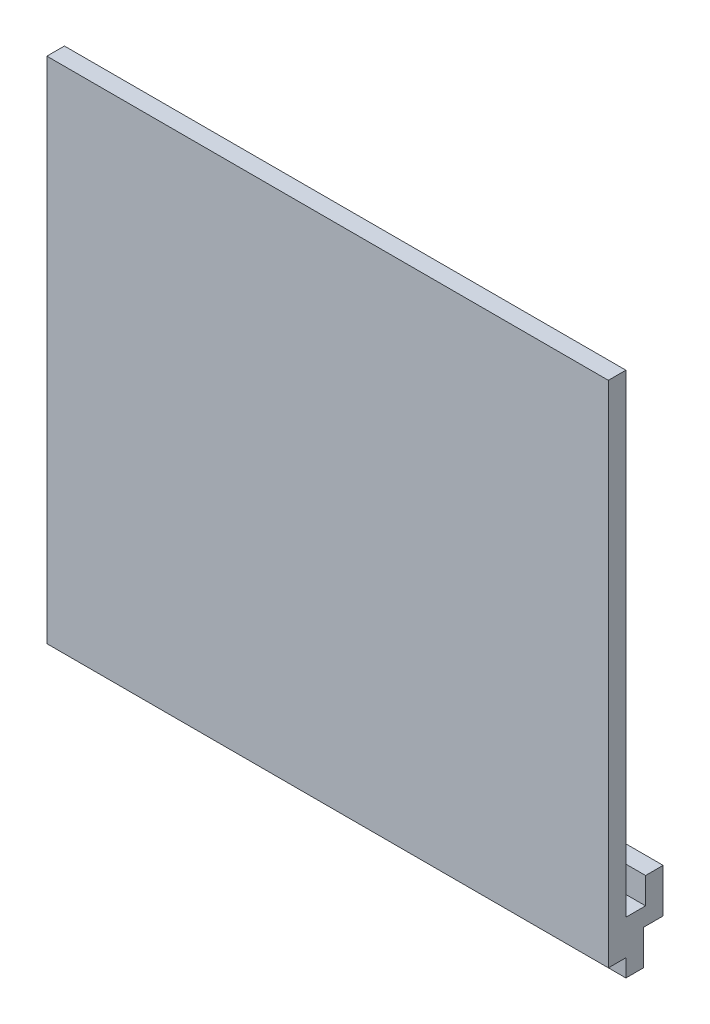
ISO-10303-21;
HEADER;
FILE_DESCRIPTION(('STEP AP214'),'2;1');
FILE_NAME('part.step','',(''),(''),'','','');
FILE_SCHEMA(('AUTOMOTIVE_DESIGN { 1 0 10303 214 1 1 1 1 }'));
ENDSEC;
DATA;
#1=APPLICATION_CONTEXT('core data for automotive mechanical design processes');
#2=APPLICATION_PROTOCOL_DEFINITION('international standard','automotive_design',2000,#1);
#3=PRODUCT_CONTEXT('',#1,'mechanical');
#4=PRODUCT('Part','Part','',(#3));
#5=PRODUCT_RELATED_PRODUCT_CATEGORY('part','',(#4));
#6=PRODUCT_DEFINITION_FORMATION('','',#4);
#7=PRODUCT_DEFINITION_CONTEXT('part definition',#1,'design');
#8=PRODUCT_DEFINITION('design','',#6,#7);
#9=PRODUCT_DEFINITION_SHAPE('','',#8);
#10=(LENGTH_UNIT() NAMED_UNIT(*) SI_UNIT(.MILLI.,.METRE.));
#11=(NAMED_UNIT(*) PLANE_ANGLE_UNIT() SI_UNIT($,.RADIAN.));
#12=(NAMED_UNIT(*) SI_UNIT($,.STERADIAN.) SOLID_ANGLE_UNIT());
#13=UNCERTAINTY_MEASURE_WITH_UNIT(LENGTH_MEASURE(1.E-05),#10,'distance_accuracy_value','');
#14=(GEOMETRIC_REPRESENTATION_CONTEXT(3) GLOBAL_UNCERTAINTY_ASSIGNED_CONTEXT((#13)) GLOBAL_UNIT_ASSIGNED_CONTEXT((#10,
#11,#12)) REPRESENTATION_CONTEXT('',''));
#15=CARTESIAN_POINT('',(0.,0.,0.));
#16=DIRECTION('',(0.,0.,1.));
#17=DIRECTION('',(1.,0.,0.));
#18=AXIS2_PLACEMENT_3D('',#15,#16,#17);
#19=CARTESIAN_POINT('',(406.4,0.,0.));
#20=DIRECTION('',(0.,1.,0.));
#21=DIRECTION('',(0.,0.,1.));
#22=AXIS2_PLACEMENT_3D('',#19,#20,#21);
#23=PLANE('',#22);
#24=DIRECTION('',(0.,0.,-1.));
#25=VECTOR('',#24,1.);
#26=CARTESIAN_POINT('',(406.4,0.,0.));
#27=LINE('',#26,#25);
#28=CARTESIAN_POINT('',(406.4,0.,-25.4));
#29=VERTEX_POINT('',#28);
#30=CARTESIAN_POINT('',(406.4,0.,-39.6393939393939));
#31=VERTEX_POINT('',#30);
#32=EDGE_CURVE('E39',#29,#31,#27,.T.);
#33=ORIENTED_EDGE('',*,*,#32,.F.);
#34=DIRECTION('',(1.,0.,0.));
#35=VECTOR('',#34,1.);
#36=CARTESIAN_POINT('',(-28.3980633142473,0.,-25.4));
#37=LINE('',#36,#35);
#38=CARTESIAN_POINT('',(0.,0.,-25.4));
#39=VERTEX_POINT('',#38);
#40=EDGE_CURVE('E201',#39,#29,#37,.T.);
#41=ORIENTED_EDGE('',*,*,#40,.F.);
#42=DIRECTION('',(0.,0.,-1.));
#43=VECTOR('',#42,1.);
#44=CARTESIAN_POINT('',(0.,0.,0.));
#45=LINE('',#44,#43);
#46=CARTESIAN_POINT('',(0.,0.,-39.6393939393939));
#47=VERTEX_POINT('',#46);
#48=EDGE_CURVE('E135',#39,#47,#45,.T.);
#49=ORIENTED_EDGE('',*,*,#48,.T.);
#50=DIRECTION('',(-1.,0.,0.));
#51=VECTOR('',#50,1.);
#52=CARTESIAN_POINT('',(406.4,0.,-39.6393939393939));
#53=LINE('',#52,#51);
#54=EDGE_CURVE('E11',#31,#47,#53,.T.);
#55=ORIENTED_EDGE('',*,*,#54,.F.);
#56=EDGE_LOOP('',(#33,#41,#49,#55));
#57=FACE_BOUND('',#56,.T.);
#58=ADVANCED_FACE('F35',(#57),#23,.F.);
#59=CARTESIAN_POINT('',(406.4,355.6,0.));
#60=DIRECTION('',(0.,0.,-1.));
#61=DIRECTION('',(0.,1.,0.));
#62=AXIS2_PLACEMENT_3D('',#59,#60,#61);
#63=PLANE('',#62);
#64=DIRECTION('',(0.,-1.,0.));
#65=VECTOR('',#64,1.);
#66=CARTESIAN_POINT('',(0.,355.6,0.));
#67=LINE('',#66,#65);
#68=CARTESIAN_POINT('',(0.,355.6,0.));
#69=VERTEX_POINT('',#68);
#70=CARTESIAN_POINT('',(0.,-12.7,0.));
#71=VERTEX_POINT('',#70);
#72=EDGE_CURVE('E132',#69,#71,#67,.T.);
#73=ORIENTED_EDGE('',*,*,#72,.T.);
#74=DIRECTION('',(1.,0.,0.));
#75=VECTOR('',#74,1.);
#76=CARTESIAN_POINT('',(-17.9605122421383,-12.7,0.));
#77=LINE('',#76,#75);
#78=CARTESIAN_POINT('',(406.4,-12.7,0.));
#79=VERTEX_POINT('',#78);
#80=EDGE_CURVE('E182',#71,#79,#77,.T.);
#81=ORIENTED_EDGE('',*,*,#80,.T.);
#82=DIRECTION('',(0.,-1.,0.));
#83=VECTOR('',#82,1.);
#84=CARTESIAN_POINT('',(406.4,355.6,0.));
#85=LINE('',#84,#83);
#86=CARTESIAN_POINT('',(406.4,355.6,0.));
#87=VERTEX_POINT('',#86);
#88=EDGE_CURVE('E151',#87,#79,#85,.T.);
#89=ORIENTED_EDGE('',*,*,#88,.F.);
#90=DIRECTION('',(-1.,0.,0.));
#91=VECTOR('',#90,1.);
#92=CARTESIAN_POINT('',(406.4,355.6,0.));
#93=LINE('',#92,#91);
#94=EDGE_CURVE('E128',#87,#69,#93,.T.);
#95=ORIENTED_EDGE('',*,*,#94,.T.);
#96=EDGE_LOOP('',(#73,#81,#89,#95));
#97=FACE_BOUND('',#96,.T.);
#98=ADVANCED_FACE('F37',(#97),#63,.F.);
#99=CARTESIAN_POINT('',(406.4,0.,-39.6393939393939));
#100=DIRECTION('',(0.,0.,1.));
#101=DIRECTION('',(0.,-1.,0.));
#102=AXIS2_PLACEMENT_3D('',#99,#100,#101);
#103=PLANE('',#102);
#104=DIRECTION('',(0.,1.,0.));
#105=VECTOR('',#104,1.);
#106=CARTESIAN_POINT('',(0.,0.,-39.6393939393939));
#107=LINE('',#106,#105);
#108=CARTESIAN_POINT('',(0.,31.75,-39.6393939393939));
#109=VERTEX_POINT('',#108);
#110=EDGE_CURVE('E139',#47,#109,#107,.T.);
#111=ORIENTED_EDGE('',*,*,#110,.T.);
#112=DIRECTION('',(-1.,0.,0.));
#113=VECTOR('',#112,1.);
#114=CARTESIAN_POINT('',(406.4,31.75,-39.6393939393939));
#115=LINE('',#114,#113);
#116=CARTESIAN_POINT('',(406.4,31.75,-39.6393939393939));
#117=VERTEX_POINT('',#116);
#118=EDGE_CURVE('E46',#117,#109,#115,.T.);
#119=ORIENTED_EDGE('',*,*,#118,.F.);
#120=DIRECTION('',(0.,1.,0.));
#121=VECTOR('',#120,1.);
#122=CARTESIAN_POINT('',(406.4,0.,-39.6393939393939));
#123=LINE('',#122,#121);
#124=EDGE_CURVE('E173',#31,#117,#123,.T.);
#125=ORIENTED_EDGE('',*,*,#124,.F.);
#126=ORIENTED_EDGE('',*,*,#54,.T.);
#127=EDGE_LOOP('',(#111,#119,#125,#126));
#128=FACE_BOUND('',#127,.T.);
#129=ADVANCED_FACE('F162',(#128),#103,.F.);
#130=CARTESIAN_POINT('',(406.4,31.75,-39.6393939393939));
#131=DIRECTION('',(0.,-1.,0.));
#132=DIRECTION('',(0.,0.,-1.));
#133=AXIS2_PLACEMENT_3D('',#130,#131,#132);
#134=PLANE('',#133);
#135=DIRECTION('',(0.,0.,1.));
#136=VECTOR('',#135,1.);
#137=CARTESIAN_POINT('',(0.,31.75,-39.6393939393939));
#138=LINE('',#137,#136);
#139=CARTESIAN_POINT('',(0.,31.75,-26.9393939393939));
#140=VERTEX_POINT('',#139);
#141=EDGE_CURVE('E155',#109,#140,#138,.T.);
#142=ORIENTED_EDGE('',*,*,#141,.T.);
#143=DIRECTION('',(-1.,0.,0.));
#144=VECTOR('',#143,1.);
#145=CARTESIAN_POINT('',(406.4,31.75,-26.9393939393939));
#146=LINE('',#145,#144);
#147=CARTESIAN_POINT('',(406.4,31.75,-26.9393939393939));
#148=VERTEX_POINT('',#147);
#149=EDGE_CURVE('E144',#148,#140,#146,.T.);
#150=ORIENTED_EDGE('',*,*,#149,.F.);
#151=DIRECTION('',(0.,0.,1.));
#152=VECTOR('',#151,1.);
#153=CARTESIAN_POINT('',(406.4,31.75,-39.6393939393939));
#154=LINE('',#153,#152);
#155=EDGE_CURVE('E168',#117,#148,#154,.T.);
#156=ORIENTED_EDGE('',*,*,#155,.F.);
#157=ORIENTED_EDGE('',*,*,#118,.T.);
#158=EDGE_LOOP('',(#142,#150,#156,#157));
#159=FACE_BOUND('',#158,.T.);
#160=ADVANCED_FACE('F167',(#159),#134,.F.);
#161=CARTESIAN_POINT('',(406.4,31.75,-26.9393939393939));
#162=DIRECTION('',(0.,0.,-1.));
#163=DIRECTION('',(0.,1.,0.));
#164=AXIS2_PLACEMENT_3D('',#161,#162,#163);
#165=PLANE('',#164);
#166=DIRECTION('',(0.,-1.,0.));
#167=VECTOR('',#166,1.);
#168=CARTESIAN_POINT('',(0.,31.75,-26.9393939393939));
#169=LINE('',#168,#167);
#170=CARTESIAN_POINT('',(0.,12.7,-26.9393939393939));
#171=VERTEX_POINT('',#170);
#172=EDGE_CURVE('E154',#140,#171,#169,.T.);
#173=ORIENTED_EDGE('',*,*,#172,.T.);
#174=DIRECTION('',(-1.,0.,0.));
#175=VECTOR('',#174,1.);
#176=CARTESIAN_POINT('',(406.4,12.7,-26.9393939393939));
#177=LINE('',#176,#175);
#178=CARTESIAN_POINT('',(406.4,12.7,-26.9393939393939));
#179=VERTEX_POINT('',#178);
#180=EDGE_CURVE('E123',#179,#171,#177,.T.);
#181=ORIENTED_EDGE('',*,*,#180,.F.);
#182=DIRECTION('',(0.,-1.,0.));
#183=VECTOR('',#182,1.);
#184=CARTESIAN_POINT('',(406.4,31.75,-26.9393939393939));
#185=LINE('',#184,#183);
#186=EDGE_CURVE('E114',#148,#179,#185,.T.);
#187=ORIENTED_EDGE('',*,*,#186,.F.);
#188=ORIENTED_EDGE('',*,*,#149,.T.);
#189=EDGE_LOOP('',(#173,#181,#187,#188));
#190=FACE_BOUND('',#189,.T.);
#191=ADVANCED_FACE('F172',(#190),#165,.F.);
#192=CARTESIAN_POINT('',(406.4,12.7,-26.9393939393939));
#193=DIRECTION('',(0.,-1.,0.));
#194=DIRECTION('',(0.,0.,-1.));
#195=AXIS2_PLACEMENT_3D('',#192,#193,#194);
#196=PLANE('',#195);
#197=DIRECTION('',(0.,0.,1.));
#198=VECTOR('',#197,1.);
#199=CARTESIAN_POINT('',(0.,12.7,-26.9393939393939));
#200=LINE('',#199,#198);
#201=CARTESIAN_POINT('',(0.,12.7,-12.7));
#202=VERTEX_POINT('',#201);
#203=EDGE_CURVE('E122',#171,#202,#200,.T.);
#204=ORIENTED_EDGE('',*,*,#203,.T.);
#205=DIRECTION('',(-1.,0.,0.));
#206=VECTOR('',#205,1.);
#207=CARTESIAN_POINT('',(406.4,12.7,-12.7));
#208=LINE('',#207,#206);
#209=CARTESIAN_POINT('',(406.4,12.7,-12.7));
#210=VERTEX_POINT('',#209);
#211=EDGE_CURVE('E119',#210,#202,#208,.T.);
#212=ORIENTED_EDGE('',*,*,#211,.F.);
#213=DIRECTION('',(0.,0.,1.));
#214=VECTOR('',#213,1.);
#215=CARTESIAN_POINT('',(406.4,12.7,-26.9393939393939));
#216=LINE('',#215,#214);
#217=EDGE_CURVE('E108',#179,#210,#216,.T.);
#218=ORIENTED_EDGE('',*,*,#217,.F.);
#219=ORIENTED_EDGE('',*,*,#180,.T.);
#220=EDGE_LOOP('',(#204,#212,#218,#219));
#221=FACE_BOUND('',#220,.T.);
#222=ADVANCED_FACE('F120',(#221),#196,.F.);
#223=CARTESIAN_POINT('',(406.4,12.7,-12.7));
#224=DIRECTION('',(0.,0.,1.));
#225=DIRECTION('',(0.,-1.,0.));
#226=AXIS2_PLACEMENT_3D('',#223,#224,#225);
#227=PLANE('',#226);
#228=DIRECTION('',(0.,1.,0.));
#229=VECTOR('',#228,1.);
#230=CARTESIAN_POINT('',(0.,12.7,-12.7));
#231=LINE('',#230,#229);
#232=CARTESIAN_POINT('',(0.,355.6,-12.7));
#233=VERTEX_POINT('',#232);
#234=EDGE_CURVE('E82',#202,#233,#231,.T.);
#235=ORIENTED_EDGE('',*,*,#234,.T.);
#236=DIRECTION('',(-1.,0.,0.));
#237=VECTOR('',#236,1.);
#238=CARTESIAN_POINT('',(406.4,355.6,-12.7));
#239=LINE('',#238,#237);
#240=CARTESIAN_POINT('',(406.4,355.6,-12.7));
#241=VERTEX_POINT('',#240);
#242=EDGE_CURVE('E124',#241,#233,#239,.T.);
#243=ORIENTED_EDGE('',*,*,#242,.F.);
#244=DIRECTION('',(0.,1.,0.));
#245=VECTOR('',#244,1.);
#246=CARTESIAN_POINT('',(406.4,12.7,-12.7));
#247=LINE('',#246,#245);
#248=EDGE_CURVE('E112',#210,#241,#247,.T.);
#249=ORIENTED_EDGE('',*,*,#248,.F.);
#250=ORIENTED_EDGE('',*,*,#211,.T.);
#251=EDGE_LOOP('',(#235,#243,#249,#250));
#252=FACE_BOUND('',#251,.T.);
#253=ADVANCED_FACE('F126',(#252),#227,.F.);
#254=CARTESIAN_POINT('',(406.4,355.6,-12.7));
#255=DIRECTION('',(0.,-1.,0.));
#256=DIRECTION('',(0.,0.,-1.));
#257=AXIS2_PLACEMENT_3D('',#254,#255,#256);
#258=PLANE('',#257);
#259=DIRECTION('',(0.,0.,1.));
#260=VECTOR('',#259,1.);
#261=CARTESIAN_POINT('',(0.,355.6,-12.7));
#262=LINE('',#261,#260);
#263=EDGE_CURVE('E88',#233,#69,#262,.T.);
#264=ORIENTED_EDGE('',*,*,#263,.T.);
#265=ORIENTED_EDGE('',*,*,#94,.F.);
#266=DIRECTION('',(0.,0.,1.));
#267=VECTOR('',#266,1.);
#268=CARTESIAN_POINT('',(406.4,355.6,-12.7));
#269=LINE('',#268,#267);
#270=EDGE_CURVE('E55',#241,#87,#269,.T.);
#271=ORIENTED_EDGE('',*,*,#270,.F.);
#272=ORIENTED_EDGE('',*,*,#242,.T.);
#273=EDGE_LOOP('',(#264,#265,#271,#272));
#274=FACE_BOUND('',#273,.T.);
#275=ADVANCED_FACE('F281',(#274),#258,.F.);
#276=CARTESIAN_POINT('',(406.4,0.,0.));
#277=DIRECTION('',(1.,0.,0.));
#278=DIRECTION('',(0.,0.,-1.));
#279=AXIS2_PLACEMENT_3D('',#276,#277,#278);
#280=PLANE('',#279);
#281=DIRECTION('',(0.,1.,0.));
#282=VECTOR('',#281,1.);
#283=CARTESIAN_POINT('',(406.4,-25.4,-25.4));
#284=LINE('',#283,#282);
#285=CARTESIAN_POINT('',(406.4,-25.4,-25.4));
#286=VERTEX_POINT('',#285);
#287=EDGE_CURVE('E198',#286,#29,#284,.T.);
#288=ORIENTED_EDGE('',*,*,#287,.T.);
#289=ORIENTED_EDGE('',*,*,#32,.T.);
#290=ORIENTED_EDGE('',*,*,#124,.T.);
#291=ORIENTED_EDGE('',*,*,#155,.T.);
#292=ORIENTED_EDGE('',*,*,#186,.T.);
#293=ORIENTED_EDGE('',*,*,#217,.T.);
#294=ORIENTED_EDGE('',*,*,#248,.T.);
#295=ORIENTED_EDGE('',*,*,#270,.T.);
#296=ORIENTED_EDGE('',*,*,#88,.T.);
#297=DIRECTION('',(0.,0.,-1.));
#298=VECTOR('',#297,1.);
#299=CARTESIAN_POINT('',(406.4,-12.7,0.));
#300=LINE('',#299,#298);
#301=CARTESIAN_POINT('',(406.4,-12.7,-12.7));
#302=VERTEX_POINT('',#301);
#303=EDGE_CURVE('E185',#79,#302,#300,.T.);
#304=ORIENTED_EDGE('',*,*,#303,.T.);
#305=DIRECTION('',(0.,-1.,0.));
#306=VECTOR('',#305,1.);
#307=CARTESIAN_POINT('',(406.4,-25.4,-12.7));
#308=LINE('',#307,#306);
#309=CARTESIAN_POINT('',(406.4,-25.4,-12.7));
#310=VERTEX_POINT('',#309);
#311=EDGE_CURVE('E209',#302,#310,#308,.T.);
#312=ORIENTED_EDGE('',*,*,#311,.T.);
#313=DIRECTION('',(0.,0.,-1.));
#314=VECTOR('',#313,1.);
#315=CARTESIAN_POINT('',(406.4,-25.4,-12.7));
#316=LINE('',#315,#314);
#317=EDGE_CURVE('E206',#310,#286,#316,.T.);
#318=ORIENTED_EDGE('',*,*,#317,.T.);
#319=EDGE_LOOP('',(#288,#289,#290,#291,#292,#293,#294,#295,#296,#304,#312,#318));
#320=FACE_BOUND('',#319,.T.);
#321=ADVANCED_FACE('F110',(#320),#280,.T.);
#322=CARTESIAN_POINT('',(0.,0.,0.));
#323=DIRECTION('',(1.,0.,0.));
#324=DIRECTION('',(0.,0.,-1.));
#325=AXIS2_PLACEMENT_3D('',#322,#323,#324);
#326=PLANE('',#325);
#327=ORIENTED_EDGE('',*,*,#48,.F.);
#328=DIRECTION('',(0.,-1.,0.));
#329=VECTOR('',#328,1.);
#330=CARTESIAN_POINT('',(0.,-25.4,-25.4));
#331=LINE('',#330,#329);
#332=CARTESIAN_POINT('',(0.,-25.4,-25.4));
#333=VERTEX_POINT('',#332);
#334=EDGE_CURVE('E204',#39,#333,#331,.T.);
#335=ORIENTED_EDGE('',*,*,#334,.T.);
#336=DIRECTION('',(0.,0.,1.));
#337=VECTOR('',#336,1.);
#338=CARTESIAN_POINT('',(0.,-25.4,-12.7));
#339=LINE('',#338,#337);
#340=CARTESIAN_POINT('',(0.,-25.4,-12.7));
#341=VERTEX_POINT('',#340);
#342=EDGE_CURVE('E190',#333,#341,#339,.T.);
#343=ORIENTED_EDGE('',*,*,#342,.T.);
#344=DIRECTION('',(0.,1.,0.));
#345=VECTOR('',#344,1.);
#346=CARTESIAN_POINT('',(0.,-25.4,-12.7));
#347=LINE('',#346,#345);
#348=CARTESIAN_POINT('',(0.,-12.7,-12.7));
#349=VERTEX_POINT('',#348);
#350=EDGE_CURVE('E193',#341,#349,#347,.T.);
#351=ORIENTED_EDGE('',*,*,#350,.T.);
#352=DIRECTION('',(0.,0.,1.));
#353=VECTOR('',#352,1.);
#354=CARTESIAN_POINT('',(0.,-12.7,0.));
#355=LINE('',#354,#353);
#356=EDGE_CURVE('E136',#349,#71,#355,.T.);
#357=ORIENTED_EDGE('',*,*,#356,.T.);
#358=ORIENTED_EDGE('',*,*,#72,.F.);
#359=ORIENTED_EDGE('',*,*,#263,.F.);
#360=ORIENTED_EDGE('',*,*,#234,.F.);
#361=ORIENTED_EDGE('',*,*,#203,.F.);
#362=ORIENTED_EDGE('',*,*,#172,.F.);
#363=ORIENTED_EDGE('',*,*,#141,.F.);
#364=ORIENTED_EDGE('',*,*,#110,.F.);
#365=EDGE_LOOP('',(#327,#335,#343,#351,#357,#358,#359,#360,#361,#362,#363,#364));
#366=FACE_BOUND('',#365,.T.);
#367=ADVANCED_FACE('F170',(#366),#326,.F.);
#368=CARTESIAN_POINT('',(-17.9605122421383,-12.7,0.));
#369=DIRECTION('',(0.,-1.,0.));
#370=DIRECTION('',(0.,0.,-1.));
#371=AXIS2_PLACEMENT_3D('',#368,#369,#370);
#372=PLANE('',#371);
#373=ORIENTED_EDGE('',*,*,#356,.F.);
#374=DIRECTION('',(1.,0.,0.));
#375=VECTOR('',#374,1.);
#376=CARTESIAN_POINT('',(-17.9605122421383,-12.7,-12.7));
#377=LINE('',#376,#375);
#378=EDGE_CURVE('E181',#349,#302,#377,.T.);
#379=ORIENTED_EDGE('',*,*,#378,.T.);
#380=ORIENTED_EDGE('',*,*,#303,.F.);
#381=ORIENTED_EDGE('',*,*,#80,.F.);
#382=EDGE_LOOP('',(#373,#379,#380,#381));
#383=FACE_BOUND('',#382,.T.);
#384=ADVANCED_FACE('F255',(#383),#372,.T.);
#385=CARTESIAN_POINT('',(-28.3980633142473,-25.4,-12.7));
#386=DIRECTION('',(0.,0.,1.));
#387=DIRECTION('',(1.,0.,0.));
#388=AXIS2_PLACEMENT_3D('',#385,#386,#387);
#389=PLANE('',#388);
#390=ORIENTED_EDGE('',*,*,#311,.F.);
#391=ORIENTED_EDGE('',*,*,#378,.F.);
#392=ORIENTED_EDGE('',*,*,#350,.F.);
#393=DIRECTION('',(1.,0.,0.));
#394=VECTOR('',#393,1.);
#395=CARTESIAN_POINT('',(-28.3980633142473,-25.4,-12.7));
#396=LINE('',#395,#394);
#397=EDGE_CURVE('E194',#341,#310,#396,.T.);
#398=ORIENTED_EDGE('',*,*,#397,.T.);
#399=EDGE_LOOP('',(#390,#391,#392,#398));
#400=FACE_BOUND('',#399,.T.);
#401=ADVANCED_FACE('F237',(#400),#389,.T.);
#402=CARTESIAN_POINT('',(-28.3980633142473,-25.4,-25.4));
#403=DIRECTION('',(0.,0.,-1.));
#404=DIRECTION('',(-1.,0.,0.));
#405=AXIS2_PLACEMENT_3D('',#402,#403,#404);
#406=PLANE('',#405);
#407=ORIENTED_EDGE('',*,*,#334,.F.);
#408=ORIENTED_EDGE('',*,*,#40,.T.);
#409=ORIENTED_EDGE('',*,*,#287,.F.);
#410=DIRECTION('',(1.,0.,0.));
#411=VECTOR('',#410,1.);
#412=CARTESIAN_POINT('',(-28.3980633142473,-25.4,-25.4));
#413=LINE('',#412,#411);
#414=EDGE_CURVE('E197',#333,#286,#413,.T.);
#415=ORIENTED_EDGE('',*,*,#414,.F.);
#416=EDGE_LOOP('',(#407,#408,#409,#415));
#417=FACE_BOUND('',#416,.T.);
#418=ADVANCED_FACE('F227',(#417),#406,.T.);
#419=CARTESIAN_POINT('',(-28.3980633142473,-25.4,-12.7));
#420=DIRECTION('',(0.,-1.,0.));
#421=DIRECTION('',(0.,0.,-1.));
#422=AXIS2_PLACEMENT_3D('',#419,#420,#421);
#423=PLANE('',#422);
#424=ORIENTED_EDGE('',*,*,#342,.F.);
#425=ORIENTED_EDGE('',*,*,#414,.T.);
#426=ORIENTED_EDGE('',*,*,#317,.F.);
#427=ORIENTED_EDGE('',*,*,#397,.F.);
#428=EDGE_LOOP('',(#424,#425,#426,#427));
#429=FACE_BOUND('',#428,.T.);
#430=ADVANCED_FACE('F232',(#429),#423,.T.);
#431=CLOSED_SHELL('',(#58,#98,#129,#160,#191,#222,#253,#275,#321,#367,#384,#401,#418,#430));
#432=MANIFOLD_SOLID_BREP('B2',#431);
#433=ADVANCED_BREP_SHAPE_REPRESENTATION('',(#18,#432),#14);
#434=SHAPE_DEFINITION_REPRESENTATION(#9,#433);
ENDSEC;
END-ISO-10303-21;
